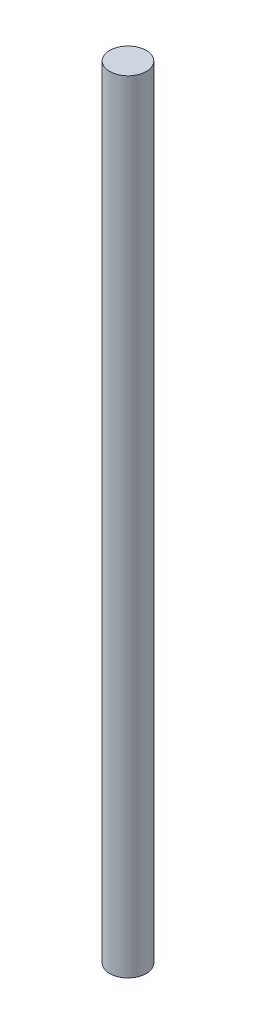
ISO-10303-21;
HEADER;
FILE_DESCRIPTION(('STEP AP214'),'2;1');
FILE_NAME('part.step','',(''),(''),'','','');
FILE_SCHEMA(('AUTOMOTIVE_DESIGN { 1 0 10303 214 1 1 1 1 }'));
ENDSEC;
DATA;
#1=APPLICATION_CONTEXT('core data for automotive mechanical design processes');
#2=APPLICATION_PROTOCOL_DEFINITION('international standard','automotive_design',2000,#1);
#3=PRODUCT_CONTEXT('',#1,'mechanical');
#4=PRODUCT('Part','Part','',(#3));
#5=PRODUCT_RELATED_PRODUCT_CATEGORY('part','',(#4));
#6=PRODUCT_DEFINITION_FORMATION('','',#4);
#7=PRODUCT_DEFINITION_CONTEXT('part definition',#1,'design');
#8=PRODUCT_DEFINITION('design','',#6,#7);
#9=PRODUCT_DEFINITION_SHAPE('','',#8);
#10=(LENGTH_UNIT() NAMED_UNIT(*) SI_UNIT(.MILLI.,.METRE.));
#11=(NAMED_UNIT(*) PLANE_ANGLE_UNIT() SI_UNIT($,.RADIAN.));
#12=(NAMED_UNIT(*) SI_UNIT($,.STERADIAN.) SOLID_ANGLE_UNIT());
#13=UNCERTAINTY_MEASURE_WITH_UNIT(LENGTH_MEASURE(1.E-05),#10,'distance_accuracy_value','');
#14=(GEOMETRIC_REPRESENTATION_CONTEXT(3) GLOBAL_UNCERTAINTY_ASSIGNED_CONTEXT((#13)) GLOBAL_UNIT_ASSIGNED_CONTEXT((#10,
#11,#12)) REPRESENTATION_CONTEXT('',''));
#15=CARTESIAN_POINT('',(0.,0.,0.));
#16=DIRECTION('',(0.,0.,1.));
#17=DIRECTION('',(1.,0.,0.));
#18=AXIS2_PLACEMENT_3D('',#15,#16,#17);
#19=CARTESIAN_POINT('',(0.,271.71015,0.));
#20=DIRECTION('',(0.,-1.,0.));
#21=DIRECTION('',(0.,0.,-1.));
#22=AXIS2_PLACEMENT_3D('',#19,#20,#21);
#23=CYLINDRICAL_SURFACE('',#22,6.35);
#24=CARTESIAN_POINT('',(0.,271.71015,0.));
#25=DIRECTION('',(0.,1.,0.));
#26=DIRECTION('',(0.,0.,1.));
#27=AXIS2_PLACEMENT_3D('',#24,#25,#26);
#28=CIRCLE('',#27,6.35);
#29=CARTESIAN_POINT('',(0.,271.71015,6.35));
#30=VERTEX_POINT('',#29);
#31=EDGE_CURVE('E10',#30,#30,#28,.T.);
#32=ORIENTED_EDGE('',*,*,#31,.F.);
#33=EDGE_LOOP('',(#32));
#34=FACE_BOUND('',#33,.T.);
#35=CARTESIAN_POINT('',(0.,0.,0.));
#36=DIRECTION('',(0.,1.,0.));
#37=DIRECTION('',(0.,0.,1.));
#38=AXIS2_PLACEMENT_3D('',#35,#36,#37);
#39=CIRCLE('',#38,6.35);
#40=CARTESIAN_POINT('',(0.,0.,6.35));
#41=VERTEX_POINT('',#40);
#42=EDGE_CURVE('E40',#41,#41,#39,.T.);
#43=ORIENTED_EDGE('',*,*,#42,.T.);
#44=EDGE_LOOP('',(#43));
#45=FACE_BOUND('',#44,.T.);
#46=ADVANCED_FACE('F37',(#34,#45),#23,.T.);
#47=CARTESIAN_POINT('',(0.,271.71015,0.));
#48=DIRECTION('',(0.,1.,0.));
#49=DIRECTION('',(0.,0.,1.));
#50=AXIS2_PLACEMENT_3D('',#47,#48,#49);
#51=PLANE('',#50);
#52=ORIENTED_EDGE('',*,*,#31,.T.);
#53=EDGE_LOOP('',(#52));
#54=FACE_BOUND('',#53,.T.);
#55=ADVANCED_FACE('F54',(#54),#51,.T.);
#56=CARTESIAN_POINT('',(0.,0.,0.));
#57=DIRECTION('',(0.,1.,0.));
#58=DIRECTION('',(0.,0.,1.));
#59=AXIS2_PLACEMENT_3D('',#56,#57,#58);
#60=PLANE('',#59);
#61=ORIENTED_EDGE('',*,*,#42,.F.);
#62=EDGE_LOOP('',(#61));
#63=FACE_BOUND('',#62,.T.);
#64=ADVANCED_FACE('F52',(#63),#60,.F.);
#65=CLOSED_SHELL('',(#46,#55,#64));
#66=MANIFOLD_SOLID_BREP('B2',#65);
#67=ADVANCED_BREP_SHAPE_REPRESENTATION('',(#18,#66),#14);
#68=SHAPE_DEFINITION_REPRESENTATION(#9,#67);
ENDSEC;
END-ISO-10303-21;
